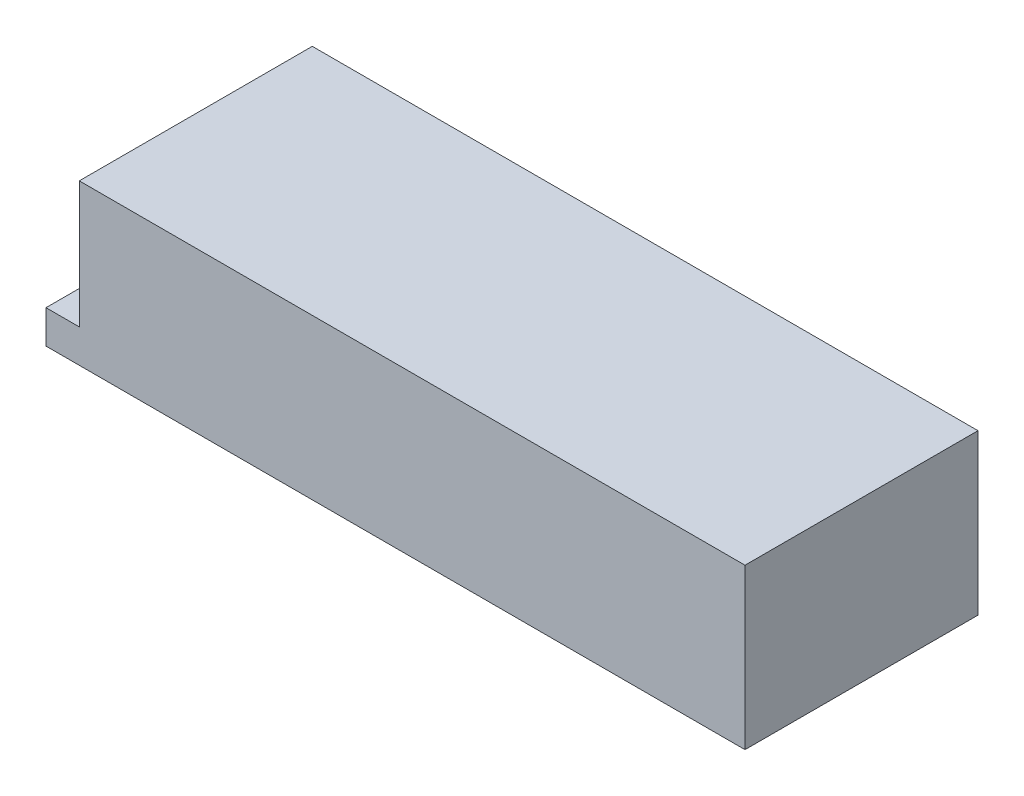
ISO-10303-21;
HEADER;
FILE_DESCRIPTION(('STEP AP214'),'2;1');
FILE_NAME('part.step','',(''),(''),'','','');
FILE_SCHEMA(('AUTOMOTIVE_DESIGN { 1 0 10303 214 1 1 1 1 }'));
ENDSEC;
DATA;
#1=APPLICATION_CONTEXT('core data for automotive mechanical design processes');
#2=APPLICATION_PROTOCOL_DEFINITION('international standard','automotive_design',2000,#1);
#3=PRODUCT_CONTEXT('',#1,'mechanical');
#4=PRODUCT('Part','Part','',(#3));
#5=PRODUCT_RELATED_PRODUCT_CATEGORY('part','',(#4));
#6=PRODUCT_DEFINITION_FORMATION('','',#4);
#7=PRODUCT_DEFINITION_CONTEXT('part definition',#1,'design');
#8=PRODUCT_DEFINITION('design','',#6,#7);
#9=PRODUCT_DEFINITION_SHAPE('','',#8);
#10=(LENGTH_UNIT() NAMED_UNIT(*) SI_UNIT(.MILLI.,.METRE.));
#11=(NAMED_UNIT(*) PLANE_ANGLE_UNIT() SI_UNIT($,.RADIAN.));
#12=(NAMED_UNIT(*) SI_UNIT($,.STERADIAN.) SOLID_ANGLE_UNIT());
#13=UNCERTAINTY_MEASURE_WITH_UNIT(LENGTH_MEASURE(1.E-05),#10,'distance_accuracy_value','');
#14=(GEOMETRIC_REPRESENTATION_CONTEXT(3) GLOBAL_UNCERTAINTY_ASSIGNED_CONTEXT((#13)) GLOBAL_UNIT_ASSIGNED_CONTEXT((#10,
#11,#12)) REPRESENTATION_CONTEXT('',''));
#15=CARTESIAN_POINT('',(0.,0.,0.));
#16=DIRECTION('',(0.,0.,1.));
#17=DIRECTION('',(1.,0.,0.));
#18=AXIS2_PLACEMENT_3D('',#15,#16,#17);
#19=CARTESIAN_POINT('',(-67.6315257543341,24.,-58.2477946006025));
#20=DIRECTION('',(1.,0.,0.));
#21=DIRECTION('',(0.,0.,-1.));
#22=AXIS2_PLACEMENT_3D('',#19,#20,#21);
#23=PLANE('',#22);
#24=DIRECTION('',(0.,0.,-1.));
#25=VECTOR('',#24,1.);
#26=CARTESIAN_POINT('',(-67.6315257543341,5.,-58.2477946006025));
#27=LINE('',#26,#25);
#28=CARTESIAN_POINT('',(-67.6315257543341,5.,-23.2477946006025));
#29=VERTEX_POINT('',#28);
#30=CARTESIAN_POINT('',(-67.6315257543341,5.,-58.2477946006025));
#31=VERTEX_POINT('',#30);
#32=EDGE_CURVE('E47',#29,#31,#27,.T.);
#33=ORIENTED_EDGE('',*,*,#32,.F.);
#34=DIRECTION('',(0.,-1.,0.));
#35=VECTOR('',#34,1.);
#36=CARTESIAN_POINT('',(-67.6315257543341,24.,-23.2477946006025));
#37=LINE('',#36,#35);
#38=CARTESIAN_POINT('',(-67.6315257543341,24.,-23.2477946006025));
#39=VERTEX_POINT('',#38);
#40=EDGE_CURVE('E11',#39,#29,#37,.T.);
#41=ORIENTED_EDGE('',*,*,#40,.F.);
#42=DIRECTION('',(0.,0.,1.));
#43=VECTOR('',#42,1.);
#44=CARTESIAN_POINT('',(-67.6315257543341,24.,-58.2477946006025));
#45=LINE('',#44,#43);
#46=CARTESIAN_POINT('',(-67.6315257543341,24.,-58.2477946006025));
#47=VERTEX_POINT('',#46);
#48=EDGE_CURVE('E103',#47,#39,#45,.T.);
#49=ORIENTED_EDGE('',*,*,#48,.F.);
#50=DIRECTION('',(0.,-1.,0.));
#51=VECTOR('',#50,1.);
#52=CARTESIAN_POINT('',(-67.6315257543341,24.,-58.2477946006025));
#53=LINE('',#52,#51);
#54=EDGE_CURVE('E128',#47,#31,#53,.T.);
#55=ORIENTED_EDGE('',*,*,#54,.T.);
#56=EDGE_LOOP('',(#33,#41,#49,#55));
#57=FACE_BOUND('',#56,.T.);
#58=ADVANCED_FACE('F31',(#57),#23,.F.);
#59=CARTESIAN_POINT('',(-67.6315257543341,24.,-23.2477946006025));
#60=DIRECTION('',(0.,0.,-1.));
#61=DIRECTION('',(-1.,0.,0.));
#62=AXIS2_PLACEMENT_3D('',#59,#60,#61);
#63=PLANE('',#62);
#64=DIRECTION('',(1.,0.,0.));
#65=VECTOR('',#64,1.);
#66=CARTESIAN_POINT('',(-67.6315257543341,0.,-23.2477946006025));
#67=LINE('',#66,#65);
#68=CARTESIAN_POINT('',(-72.6315257543341,0.,-23.2477946006025));
#69=VERTEX_POINT('',#68);
#70=CARTESIAN_POINT('',(32.3684742456659,0.,-23.2477946006025));
#71=VERTEX_POINT('',#70);
#72=EDGE_CURVE('E108',#69,#71,#67,.T.);
#73=ORIENTED_EDGE('',*,*,#72,.T.);
#74=DIRECTION('',(0.,-1.,0.));
#75=VECTOR('',#74,1.);
#76=CARTESIAN_POINT('',(32.3684742456659,24.,-23.2477946006025));
#77=LINE('',#76,#75);
#78=CARTESIAN_POINT('',(32.3684742456659,24.,-23.2477946006025));
#79=VERTEX_POINT('',#78);
#80=EDGE_CURVE('E39',#79,#71,#77,.T.);
#81=ORIENTED_EDGE('',*,*,#80,.F.);
#82=DIRECTION('',(1.,0.,0.));
#83=VECTOR('',#82,1.);
#84=CARTESIAN_POINT('',(-67.6315257543341,24.,-23.2477946006025));
#85=LINE('',#84,#83);
#86=EDGE_CURVE('E78',#39,#79,#85,.T.);
#87=ORIENTED_EDGE('',*,*,#86,.F.);
#88=ORIENTED_EDGE('',*,*,#40,.T.);
#89=DIRECTION('',(1.,0.,0.));
#90=VECTOR('',#89,1.);
#91=CARTESIAN_POINT('',(-72.6315257543341,5.,-23.2477946006025));
#92=LINE('',#91,#90);
#93=CARTESIAN_POINT('',(-72.6315257543341,5.,-23.2477946006025));
#94=VERTEX_POINT('',#93);
#95=EDGE_CURVE('E131',#94,#29,#92,.T.);
#96=ORIENTED_EDGE('',*,*,#95,.F.);
#97=DIRECTION('',(0.,1.,0.));
#98=VECTOR('',#97,1.);
#99=CARTESIAN_POINT('',(-72.6315257543341,0.,-23.2477946006025));
#100=LINE('',#99,#98);
#101=EDGE_CURVE('E111',#69,#94,#100,.T.);
#102=ORIENTED_EDGE('',*,*,#101,.F.);
#103=EDGE_LOOP('',(#73,#81,#87,#88,#96,#102));
#104=FACE_BOUND('',#103,.T.);
#105=ADVANCED_FACE('F148',(#104),#63,.F.);
#106=CARTESIAN_POINT('',(32.3684742456659,24.,-58.2477946006025));
#107=DIRECTION('',(-1.,0.,0.));
#108=DIRECTION('',(0.,0.,1.));
#109=AXIS2_PLACEMENT_3D('',#106,#107,#108);
#110=PLANE('',#109);
#111=DIRECTION('',(0.,0.,-1.));
#112=VECTOR('',#111,1.);
#113=CARTESIAN_POINT('',(32.3684742456659,0.,-58.2477946006025));
#114=LINE('',#113,#112);
#115=CARTESIAN_POINT('',(32.3684742456659,0.,-58.2477946006025));
#116=VERTEX_POINT('',#115);
#117=EDGE_CURVE('E71',#71,#116,#114,.T.);
#118=ORIENTED_EDGE('',*,*,#117,.T.);
#119=DIRECTION('',(0.,-1.,0.));
#120=VECTOR('',#119,1.);
#121=CARTESIAN_POINT('',(32.3684742456659,24.,-58.2477946006025));
#122=LINE('',#121,#120);
#123=CARTESIAN_POINT('',(32.3684742456659,24.,-58.2477946006025));
#124=VERTEX_POINT('',#123);
#125=EDGE_CURVE('E101',#124,#116,#122,.T.);
#126=ORIENTED_EDGE('',*,*,#125,.F.);
#127=DIRECTION('',(0.,0.,-1.));
#128=VECTOR('',#127,1.);
#129=CARTESIAN_POINT('',(32.3684742456659,24.,-58.2477946006025));
#130=LINE('',#129,#128);
#131=EDGE_CURVE('E147',#79,#124,#130,.T.);
#132=ORIENTED_EDGE('',*,*,#131,.F.);
#133=ORIENTED_EDGE('',*,*,#80,.T.);
#134=EDGE_LOOP('',(#118,#126,#132,#133));
#135=FACE_BOUND('',#134,.T.);
#136=ADVANCED_FACE('F146',(#135),#110,.F.);
#137=CARTESIAN_POINT('',(-67.6315257543341,24.,-58.2477946006025));
#138=DIRECTION('',(0.,0.,1.));
#139=DIRECTION('',(1.,0.,0.));
#140=AXIS2_PLACEMENT_3D('',#137,#138,#139);
#141=PLANE('',#140);
#142=DIRECTION('',(-1.,0.,0.));
#143=VECTOR('',#142,1.);
#144=CARTESIAN_POINT('',(-67.6315257543341,0.,-58.2477946006025));
#145=LINE('',#144,#143);
#146=CARTESIAN_POINT('',(-72.6315257543341,0.,-58.2477946006025));
#147=VERTEX_POINT('',#146);
#148=EDGE_CURVE('E95',#116,#147,#145,.T.);
#149=ORIENTED_EDGE('',*,*,#148,.T.);
#150=DIRECTION('',(0.,-1.,0.));
#151=VECTOR('',#150,1.);
#152=CARTESIAN_POINT('',(-72.6315257543341,0.,-58.2477946006025));
#153=LINE('',#152,#151);
#154=CARTESIAN_POINT('',(-72.6315257543341,5.,-58.2477946006025));
#155=VERTEX_POINT('',#154);
#156=EDGE_CURVE('E100',#155,#147,#153,.T.);
#157=ORIENTED_EDGE('',*,*,#156,.F.);
#158=DIRECTION('',(1.,0.,0.));
#159=VECTOR('',#158,1.);
#160=CARTESIAN_POINT('',(-72.6315257543341,5.,-58.2477946006025));
#161=LINE('',#160,#159);
#162=EDGE_CURVE('E122',#155,#31,#161,.T.);
#163=ORIENTED_EDGE('',*,*,#162,.T.);
#164=ORIENTED_EDGE('',*,*,#54,.F.);
#165=DIRECTION('',(-1.,0.,0.));
#166=VECTOR('',#165,1.);
#167=CARTESIAN_POINT('',(-67.6315257543341,24.,-58.2477946006025));
#168=LINE('',#167,#166);
#169=EDGE_CURVE('E55',#124,#47,#168,.T.);
#170=ORIENTED_EDGE('',*,*,#169,.F.);
#171=ORIENTED_EDGE('',*,*,#125,.T.);
#172=EDGE_LOOP('',(#149,#157,#163,#164,#170,#171));
#173=FACE_BOUND('',#172,.T.);
#174=ADVANCED_FACE('F97',(#173),#141,.F.);
#175=CARTESIAN_POINT('',(-67.6315257543341,24.,-23.2477946006025));
#176=DIRECTION('',(0.,1.,0.));
#177=DIRECTION('',(0.,0.,1.));
#178=AXIS2_PLACEMENT_3D('',#175,#176,#177);
#179=PLANE('',#178);
#180=ORIENTED_EDGE('',*,*,#48,.T.);
#181=ORIENTED_EDGE('',*,*,#86,.T.);
#182=ORIENTED_EDGE('',*,*,#131,.T.);
#183=ORIENTED_EDGE('',*,*,#169,.T.);
#184=EDGE_LOOP('',(#180,#181,#182,#183));
#185=FACE_BOUND('',#184,.T.);
#186=ADVANCED_FACE('F158',(#185),#179,.T.);
#187=CARTESIAN_POINT('',(-67.6315257543341,0.,-23.2477946006025));
#188=DIRECTION('',(0.,1.,0.));
#189=DIRECTION('',(0.,0.,1.));
#190=AXIS2_PLACEMENT_3D('',#187,#188,#189);
#191=PLANE('',#190);
#192=ORIENTED_EDGE('',*,*,#72,.F.);
#193=DIRECTION('',(0.,0.,1.));
#194=VECTOR('',#193,1.);
#195=CARTESIAN_POINT('',(-72.6315257543341,0.,-58.2477946006025));
#196=LINE('',#195,#194);
#197=EDGE_CURVE('E106',#147,#69,#196,.T.);
#198=ORIENTED_EDGE('',*,*,#197,.F.);
#199=ORIENTED_EDGE('',*,*,#148,.F.);
#200=ORIENTED_EDGE('',*,*,#117,.F.);
#201=EDGE_LOOP('',(#192,#198,#199,#200));
#202=FACE_BOUND('',#201,.T.);
#203=ADVANCED_FACE('F107',(#202),#191,.F.);
#204=CARTESIAN_POINT('',(-72.6315257543341,5.,-58.2477946006025));
#205=DIRECTION('',(0.,-1.,0.));
#206=DIRECTION('',(0.,0.,-1.));
#207=AXIS2_PLACEMENT_3D('',#204,#205,#206);
#208=PLANE('',#207);
#209=ORIENTED_EDGE('',*,*,#32,.T.);
#210=ORIENTED_EDGE('',*,*,#162,.F.);
#211=DIRECTION('',(0.,0.,-1.));
#212=VECTOR('',#211,1.);
#213=CARTESIAN_POINT('',(-72.6315257543341,5.,-58.2477946006025));
#214=LINE('',#213,#212);
#215=EDGE_CURVE('E115',#94,#155,#214,.T.);
#216=ORIENTED_EDGE('',*,*,#215,.F.);
#217=ORIENTED_EDGE('',*,*,#95,.T.);
#218=EDGE_LOOP('',(#209,#210,#216,#217));
#219=FACE_BOUND('',#218,.T.);
#220=ADVANCED_FACE('F161',(#219),#208,.F.);
#221=CARTESIAN_POINT('',(-72.6315257543341,5.,-58.2477946006025));
#222=DIRECTION('',(1.,0.,0.));
#223=DIRECTION('',(0.,0.,-1.));
#224=AXIS2_PLACEMENT_3D('',#221,#222,#223);
#225=PLANE('',#224);
#226=ORIENTED_EDGE('',*,*,#156,.T.);
#227=ORIENTED_EDGE('',*,*,#197,.T.);
#228=ORIENTED_EDGE('',*,*,#101,.T.);
#229=ORIENTED_EDGE('',*,*,#215,.T.);
#230=EDGE_LOOP('',(#226,#227,#228,#229));
#231=FACE_BOUND('',#230,.T.);
#232=ADVANCED_FACE('F113',(#231),#225,.F.);
#233=CLOSED_SHELL('',(#58,#105,#136,#174,#186,#203,#220,#232));
#234=MANIFOLD_SOLID_BREP('B2',#233);
#235=ADVANCED_BREP_SHAPE_REPRESENTATION('',(#18,#234),#14);
#236=SHAPE_DEFINITION_REPRESENTATION(#9,#235);
ENDSEC;
END-ISO-10303-21;
